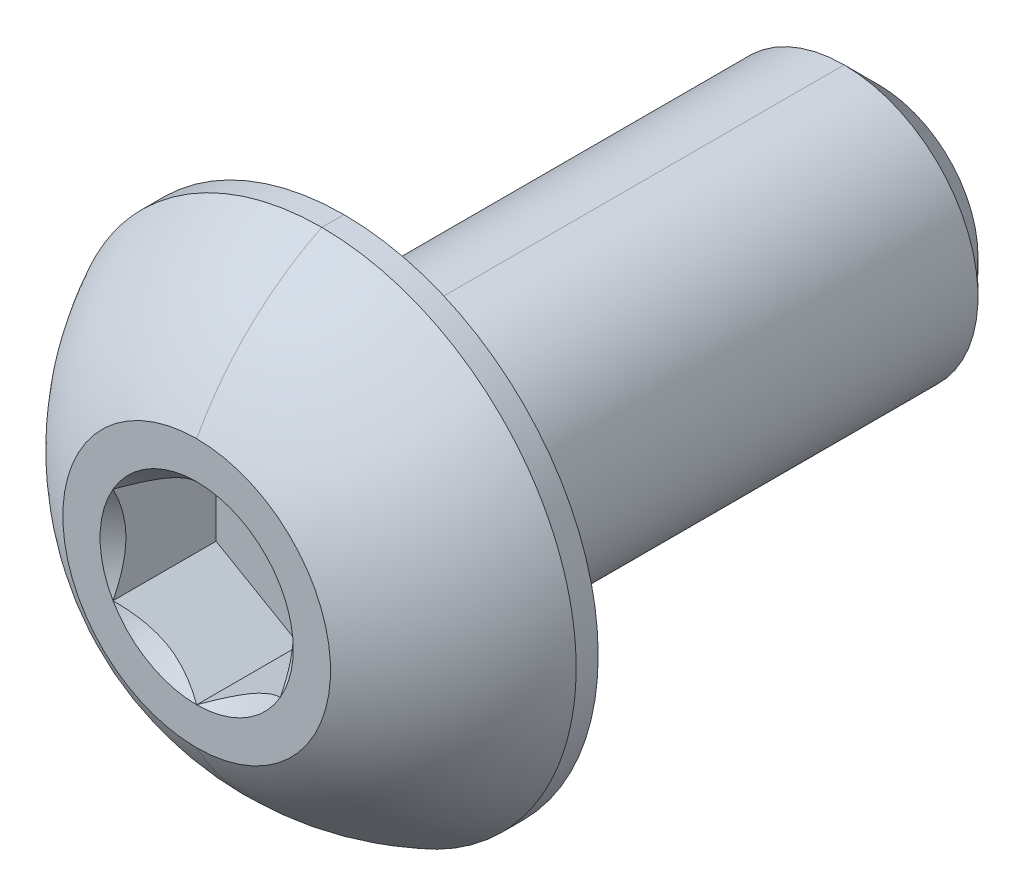
ISO-10303-21;
HEADER;
FILE_DESCRIPTION(('STEP AP214'),'2;1');
FILE_NAME('part.step','',(''),(''),'','','');
FILE_SCHEMA(('AUTOMOTIVE_DESIGN { 1 0 10303 214 1 1 1 1 }'));
ENDSEC;
DATA;
#1=APPLICATION_CONTEXT('core data for automotive mechanical design processes');
#2=APPLICATION_PROTOCOL_DEFINITION('international standard','automotive_design',2000,#1);
#3=PRODUCT_CONTEXT('',#1,'mechanical');
#4=PRODUCT('Part','Part','',(#3));
#5=PRODUCT_RELATED_PRODUCT_CATEGORY('part','',(#4));
#6=PRODUCT_DEFINITION_FORMATION('','',#4);
#7=PRODUCT_DEFINITION_CONTEXT('part definition',#1,'design');
#8=PRODUCT_DEFINITION('design','',#6,#7);
#9=PRODUCT_DEFINITION_SHAPE('','',#8);
#10=(LENGTH_UNIT() NAMED_UNIT(*) SI_UNIT(.MILLI.,.METRE.));
#11=(NAMED_UNIT(*) PLANE_ANGLE_UNIT() SI_UNIT($,.RADIAN.));
#12=(NAMED_UNIT(*) SI_UNIT($,.STERADIAN.) SOLID_ANGLE_UNIT());
#13=UNCERTAINTY_MEASURE_WITH_UNIT(LENGTH_MEASURE(1.E-05),#10,'distance_accuracy_value','');
#14=(GEOMETRIC_REPRESENTATION_CONTEXT(3) GLOBAL_UNCERTAINTY_ASSIGNED_CONTEXT((#13)) GLOBAL_UNIT_ASSIGNED_CONTEXT((#10,
#11,#12)) REPRESENTATION_CONTEXT('',''));
#15=CARTESIAN_POINT('',(0.,0.,0.));
#16=DIRECTION('',(0.,0.,1.));
#17=DIRECTION('',(1.,0.,0.));
#18=AXIS2_PLACEMENT_3D('',#15,#16,#17);
#19=CARTESIAN_POINT('',(0.,-1.44337567297407,4.66));
#20=DIRECTION('',(0.5,-0.866025403784439,0.));
#21=DIRECTION('',(0.,0.,-1.));
#22=AXIS2_PLACEMENT_3D('',#19,#20,#21);
#23=PLANE('',#22);
#24=DIRECTION('',(0.,0.,1.));
#25=VECTOR('',#24,1.);
#26=CARTESIAN_POINT('',(0.,-1.44337567297407,4.66));
#27=LINE('',#26,#25);
#28=CARTESIAN_POINT('',(0.,-1.44337567297407,4.66));
#29=VERTEX_POINT('',#28);
#30=CARTESIAN_POINT('',(0.,-1.44337567297406,6.2));
#31=VERTEX_POINT('',#30);
#32=EDGE_CURVE('E11',#29,#31,#27,.T.);
#33=ORIENTED_EDGE('',*,*,#32,.T.);
#34=CARTESIAN_POINT('',(0.,-1.44337567297407,6.2));
#35=CARTESIAN_POINT('',(0.333439312721844,-1.25086439601571,6.00748872304164));
#36=CARTESIAN_POINT('',(0.622697264378245,-1.08386123976164,6.00662715507142));
#37=CARTESIAN_POINT('',(0.913567808929031,-0.915927052565914,6.0057607839199));
#38=CARTESIAN_POINT('',(1.25,-0.721687836487034,6.2));
#39=B_SPLINE_CURVE_WITH_KNOTS('',2,(#34,#35,#36,#37,#38),.UNSPECIFIED.,.F.,.F.,(3,2,3),(0.,0.5,
1.),.UNSPECIFIED.);
#40=CARTESIAN_POINT('',(1.25,-0.721687836487033,6.2));
#41=VERTEX_POINT('',#40);
#42=EDGE_CURVE('E118',#31,#41,#39,.T.);
#43=ORIENTED_EDGE('',*,*,#42,.T.);
#44=DIRECTION('',(0.,0.,1.));
#45=VECTOR('',#44,1.);
#46=CARTESIAN_POINT('',(1.25,-0.721687836487034,4.66));
#47=LINE('',#46,#45);
#48=CARTESIAN_POINT('',(1.25,-0.721687836487034,4.66));
#49=VERTEX_POINT('',#48);
#50=EDGE_CURVE('E97',#49,#41,#47,.T.);
#51=ORIENTED_EDGE('',*,*,#50,.F.);
#52=DIRECTION('',(0.866025403784439,0.5,0.));
#53=VECTOR('',#52,1.);
#54=CARTESIAN_POINT('',(0.,-1.44337567297407,4.66));
#55=LINE('',#54,#53);
#56=EDGE_CURVE('E111',#29,#49,#55,.T.);
#57=ORIENTED_EDGE('',*,*,#56,.F.);
#58=EDGE_LOOP('',(#33,#43,#51,#57));
#59=FACE_BOUND('',#58,.T.);
#60=ADVANCED_FACE('F16',(#59),#23,.F.);
#61=CARTESIAN_POINT('',(-1.25,-0.721687836487034,4.66));
#62=DIRECTION('',(-0.5,-0.866025403784439,0.));
#63=DIRECTION('',(-0.866025403784439,0.5,0.));
#64=AXIS2_PLACEMENT_3D('',#61,#62,#63);
#65=PLANE('',#64);
#66=DIRECTION('',(0.,0.,1.));
#67=VECTOR('',#66,1.);
#68=CARTESIAN_POINT('',(-1.25,-0.721687836487034,4.66));
#69=LINE('',#68,#67);
#70=CARTESIAN_POINT('',(-1.25,-0.721687836487034,4.66));
#71=VERTEX_POINT('',#70);
#72=CARTESIAN_POINT('',(-1.25,-0.721687836487033,6.2));
#73=VERTEX_POINT('',#72);
#74=EDGE_CURVE('E28',#71,#73,#69,.T.);
#75=ORIENTED_EDGE('',*,*,#74,.T.);
#76=CARTESIAN_POINT('',(-1.25,-0.721687836487034,6.2));
#77=CARTESIAN_POINT('',(-0.916560687278626,-0.914199113445123,6.00748872304191));
#78=CARTESIAN_POINT('',(-0.627302735621756,-1.08120226969946,6.00662715507142));
#79=CARTESIAN_POINT('',(-0.336432191071441,-1.24913645689491,6.00576078391963));
#80=CARTESIAN_POINT('',(0.,-1.44337567297406,6.2));
#81=B_SPLINE_CURVE_WITH_KNOTS('',2,(#76,#77,#78,#79,#80),.UNSPECIFIED.,.F.,.F.,(3,2,3),(0.,0.5,
1.),.UNSPECIFIED.);
#82=EDGE_CURVE('E385',#73,#31,#81,.T.);
#83=ORIENTED_EDGE('',*,*,#82,.T.);
#84=ORIENTED_EDGE('',*,*,#32,.F.);
#85=DIRECTION('',(0.866025403784439,-0.5,0.));
#86=VECTOR('',#85,1.);
#87=CARTESIAN_POINT('',(-1.25,-0.721687836487034,4.66));
#88=LINE('',#87,#86);
#89=EDGE_CURVE('E128',#71,#29,#88,.T.);
#90=ORIENTED_EDGE('',*,*,#89,.F.);
#91=EDGE_LOOP('',(#75,#83,#84,#90));
#92=FACE_BOUND('',#91,.T.);
#93=ADVANCED_FACE('F349',(#92),#65,.F.);
#94=CARTESIAN_POINT('',(-1.25,0.72168783648703,4.66));
#95=DIRECTION('',(-1.,0.,0.));
#96=DIRECTION('',(0.,1.,0.));
#97=AXIS2_PLACEMENT_3D('',#94,#95,#96);
#98=PLANE('',#97);
#99=DIRECTION('',(0.,0.,1.));
#100=VECTOR('',#99,1.);
#101=CARTESIAN_POINT('',(-1.25,0.72168783648703,4.66));
#102=LINE('',#101,#100);
#103=CARTESIAN_POINT('',(-1.25,0.72168783648703,4.66));
#104=VERTEX_POINT('',#103);
#105=CARTESIAN_POINT('',(-1.25,0.721687836487029,6.2));
#106=VERTEX_POINT('',#105);
#107=EDGE_CURVE('E55',#104,#106,#102,.T.);
#108=ORIENTED_EDGE('',*,*,#107,.T.);
#109=CARTESIAN_POINT('',(-1.25,0.721687836487029,6.2));
#110=CARTESIAN_POINT('',(-1.25,0.538092414489135,6.10820228900105));
#111=CARTESIAN_POINT('',(-1.25,0.371670740916254,6.06070988390206));
#112=CARTESIAN_POINT('',(-1.25,0.182469151637206,6.00671668499652));
#113=CARTESIAN_POINT('',(-1.25,7.86844094999208E-05,6.00662432950243));
#114=CARTESIAN_POINT('',(-1.25,-0.181256710002667,6.00653250825651));
#115=CARTESIAN_POINT('',(-1.25,-0.371515987727134,6.06066578692546));
#116=CARTESIAN_POINT('',(-1.25,-0.537435467854396,6.10787381568368));
#117=CARTESIAN_POINT('',(-1.25,-0.721687836487034,6.2));
#118=B_SPLINE_CURVE_WITH_KNOTS('',2,(#109,#110,#111,#112,#113,#114,#115,#116,#117),
.UNSPECIFIED.,.F.,.F.,(3,2,2,2,3),(0.,0.25,0.5,0.75,1.),.UNSPECIFIED.);
#119=EDGE_CURVE('E360',#106,#73,#118,.T.);
#120=ORIENTED_EDGE('',*,*,#119,.T.);
#121=ORIENTED_EDGE('',*,*,#74,.F.);
#122=DIRECTION('',(0.,-1.,0.));
#123=VECTOR('',#122,1.);
#124=CARTESIAN_POINT('',(-1.25,0.72168783648703,4.66));
#125=LINE('',#124,#123);
#126=EDGE_CURVE('E124',#104,#71,#125,.T.);
#127=ORIENTED_EDGE('',*,*,#126,.F.);
#128=EDGE_LOOP('',(#108,#120,#121,#127));
#129=FACE_BOUND('',#128,.T.);
#130=ADVANCED_FACE('F346',(#129),#98,.F.);
#131=CARTESIAN_POINT('',(0.,1.44337567297406,4.66));
#132=DIRECTION('',(-0.5,0.866025403784439,0.));
#133=DIRECTION('',(0.,0.,1.));
#134=AXIS2_PLACEMENT_3D('',#131,#132,#133);
#135=PLANE('',#134);
#136=DIRECTION('',(0.,0.,1.));
#137=VECTOR('',#136,1.);
#138=CARTESIAN_POINT('',(0.,1.44337567297406,4.66));
#139=LINE('',#138,#137);
#140=CARTESIAN_POINT('',(0.,1.44337567297406,4.66));
#141=VERTEX_POINT('',#140);
#142=CARTESIAN_POINT('',(0.,1.44337567297406,6.2));
#143=VERTEX_POINT('',#142);
#144=EDGE_CURVE('E96',#141,#143,#139,.T.);
#145=ORIENTED_EDGE('',*,*,#144,.T.);
#146=CARTESIAN_POINT('',(0.,1.44337567297406,6.2));
#147=CARTESIAN_POINT('',(-0.33343931272091,1.25086439601624,6.00748872304218));
#148=CARTESIAN_POINT('',(-0.622697264378247,1.08386123976164,6.00662715507142));
#149=CARTESIAN_POINT('',(-0.913567808928087,0.915927052566455,6.00576078391935));
#150=CARTESIAN_POINT('',(-1.25,0.721687836487029,6.2));
#151=B_SPLINE_CURVE_WITH_KNOTS('',2,(#146,#147,#148,#149,#150),.UNSPECIFIED.,.F.,.F.,(3,2,3),
(0.,0.5,1.),.UNSPECIFIED.);
#152=EDGE_CURVE('E333',#143,#106,#151,.T.);
#153=ORIENTED_EDGE('',*,*,#152,.T.);
#154=ORIENTED_EDGE('',*,*,#107,.F.);
#155=DIRECTION('',(-0.866025403784439,-0.5,0.));
#156=VECTOR('',#155,1.);
#157=CARTESIAN_POINT('',(0.,1.44337567297406,4.66));
#158=LINE('',#157,#156);
#159=EDGE_CURVE('E106',#141,#104,#158,.T.);
#160=ORIENTED_EDGE('',*,*,#159,.F.);
#161=EDGE_LOOP('',(#145,#153,#154,#160));
#162=FACE_BOUND('',#161,.T.);
#163=ADVANCED_FACE('F337',(#162),#135,.F.);
#164=CARTESIAN_POINT('',(1.25,0.721687836487031,4.66));
#165=DIRECTION('',(0.5,0.866025403784439,0.));
#166=DIRECTION('',(0.,0.,-1.));
#167=AXIS2_PLACEMENT_3D('',#164,#165,#166);
#168=PLANE('',#167);
#169=DIRECTION('',(0.,0.,1.));
#170=VECTOR('',#169,1.);
#171=CARTESIAN_POINT('',(1.25,0.721687836487031,4.66));
#172=LINE('',#171,#170);
#173=CARTESIAN_POINT('',(1.25,0.721687836487031,4.66));
#174=VERTEX_POINT('',#173);
#175=CARTESIAN_POINT('',(1.25,0.721687836487031,6.2));
#176=VERTEX_POINT('',#175);
#177=EDGE_CURVE('E80',#174,#176,#172,.T.);
#178=ORIENTED_EDGE('',*,*,#177,.T.);
#179=CARTESIAN_POINT('',(1.25,0.721687836487031,6.2));
#180=CARTESIAN_POINT('',(0.916560687277691,0.91419911344566,6.00748872304137));
#181=CARTESIAN_POINT('',(0.627302735621755,1.08120226969945,6.00662715507142));
#182=CARTESIAN_POINT('',(0.336432191070495,1.24913645689546,6.00576078392016));
#183=CARTESIAN_POINT('',(0.,1.44337567297406,6.2));
#184=B_SPLINE_CURVE_WITH_KNOTS('',2,(#179,#180,#181,#182,#183),.UNSPECIFIED.,.F.,.F.,(3,2,3),
(0.,0.5,1.),.UNSPECIFIED.);
#185=EDGE_CURVE('E269',#176,#143,#184,.T.);
#186=ORIENTED_EDGE('',*,*,#185,.T.);
#187=ORIENTED_EDGE('',*,*,#144,.F.);
#188=DIRECTION('',(-0.866025403784439,0.5,0.));
#189=VECTOR('',#188,1.);
#190=CARTESIAN_POINT('',(1.25,0.721687836487031,4.66));
#191=LINE('',#190,#189);
#192=EDGE_CURVE('E100',#174,#141,#191,.T.);
#193=ORIENTED_EDGE('',*,*,#192,.F.);
#194=EDGE_LOOP('',(#178,#186,#187,#193));
#195=FACE_BOUND('',#194,.T.);
#196=ADVANCED_FACE('F101',(#195),#168,.F.);
#197=CARTESIAN_POINT('',(1.25,-0.721687836487034,4.66));
#198=DIRECTION('',(1.,0.,0.));
#199=DIRECTION('',(0.,1.,0.));
#200=AXIS2_PLACEMENT_3D('',#197,#198,#199);
#201=PLANE('',#200);
#202=ORIENTED_EDGE('',*,*,#50,.T.);
#203=CARTESIAN_POINT('',(1.25,-0.721687836487033,6.2));
#204=CARTESIAN_POINT('',(1.25,-0.538882168791192,6.10859716615208));
#205=CARTESIAN_POINT('',(1.25,-0.371553327845962,6.0606764254612));
#206=CARTESIAN_POINT('',(1.25,-0.182815114466231,6.00662432702594));
#207=CARTESIAN_POINT('',(1.25,0.,6.00662432702594));
#208=B_SPLINE_CURVE_WITH_KNOTS('',2,(#203,#204,#205,#206,#207),.UNSPECIFIED.,.F.,.F.,(3,2,3),
(0.,0.5,1.),.UNSPECIFIED.);
#209=CARTESIAN_POINT('',(1.25,0.,6.00662432702594));
#210=VERTEX_POINT('',#209);
#211=EDGE_CURVE('E367',#41,#210,#208,.T.);
#212=ORIENTED_EDGE('',*,*,#211,.T.);
#213=CARTESIAN_POINT('',(1.25,0.,6.00662432702594));
#214=CARTESIAN_POINT('',(1.25,0.18089664890035,6.00662432702594));
#215=CARTESIAN_POINT('',(1.25,0.371633306232304,6.0606992153283));
#216=CARTESIAN_POINT('',(1.25,0.536655871568196,6.10748401754058));
#217=CARTESIAN_POINT('',(1.25,0.72168783648703,6.2));
#218=B_SPLINE_CURVE_WITH_KNOTS('',2,(#213,#214,#215,#216,#217),.UNSPECIFIED.,.F.,.F.,(3,2,3),
(0.,0.5,1.),.UNSPECIFIED.);
#219=EDGE_CURVE('E90',#210,#176,#218,.T.);
#220=ORIENTED_EDGE('',*,*,#219,.T.);
#221=ORIENTED_EDGE('',*,*,#177,.F.);
#222=DIRECTION('',(0.,1.,0.));
#223=VECTOR('',#222,1.);
#224=CARTESIAN_POINT('',(1.25,-0.721687836487034,4.66));
#225=LINE('',#224,#223);
#226=EDGE_CURVE('E85',#49,#174,#225,.T.);
#227=ORIENTED_EDGE('',*,*,#226,.F.);
#228=EDGE_LOOP('',(#202,#212,#220,#221,#227));
#229=FACE_BOUND('',#228,.T.);
#230=ADVANCED_FACE('F83',(#229),#201,.F.);
#231=CARTESIAN_POINT('',(1.25,-0.721687836487033,4.66));
#232=DIRECTION('',(0.,0.,1.));
#233=DIRECTION('',(1.,0.,0.));
#234=AXIS2_PLACEMENT_3D('',#231,#232,#233);
#235=PLANE('',#234);
#236=ORIENTED_EDGE('',*,*,#56,.T.);
#237=ORIENTED_EDGE('',*,*,#226,.T.);
#238=ORIENTED_EDGE('',*,*,#192,.T.);
#239=ORIENTED_EDGE('',*,*,#159,.T.);
#240=ORIENTED_EDGE('',*,*,#126,.T.);
#241=ORIENTED_EDGE('',*,*,#89,.T.);
#242=EDGE_LOOP('',(#236,#237,#238,#239,#240,#241));
#243=FACE_BOUND('',#242,.T.);
#244=ADVANCED_FACE('F108',(#243),#235,.T.);
#245=CARTESIAN_POINT('',(0.,0.,6.2));
#246=DIRECTION('',(0.,0.,1.));
#247=DIRECTION('',(1.,0.,0.));
#248=AXIS2_PLACEMENT_3D('',#245,#246,#247);
#249=CONICAL_SURFACE('',#248,1.44337567297406,0.78539816339745);
#250=CARTESIAN_POINT('',(0.,0.,6.2));
#251=DIRECTION('',(0.,0.,1.));
#252=DIRECTION('',(1.,0.,0.));
#253=AXIS2_PLACEMENT_3D('',#250,#251,#252);
#254=CIRCLE('',#253,1.44337567297406);
#255=EDGE_CURVE('E401',#31,#41,#254,.T.);
#256=ORIENTED_EDGE('',*,*,#255,.T.);
#257=ORIENTED_EDGE('',*,*,#42,.F.);
#258=EDGE_LOOP('',(#256,#257));
#259=FACE_BOUND('',#258,.T.);
#260=ADVANCED_FACE('F153',(#259),#249,.F.);
#261=CARTESIAN_POINT('',(0.,0.,6.2));
#262=DIRECTION('',(0.,0.,1.));
#263=DIRECTION('',(1.,0.,0.));
#264=AXIS2_PLACEMENT_3D('',#261,#262,#263);
#265=CONICAL_SURFACE('',#264,1.44337567297406,0.78539816339745);
#266=CARTESIAN_POINT('',(0.,0.,6.2));
#267=DIRECTION('',(0.,0.,1.));
#268=DIRECTION('',(1.,0.,0.));
#269=AXIS2_PLACEMENT_3D('',#266,#267,#268);
#270=CIRCLE('',#269,1.44337567297406);
#271=EDGE_CURVE('E368',#73,#31,#270,.T.);
#272=ORIENTED_EDGE('',*,*,#271,.T.);
#273=ORIENTED_EDGE('',*,*,#82,.F.);
#274=EDGE_LOOP('',(#272,#273));
#275=FACE_BOUND('',#274,.T.);
#276=ADVANCED_FACE('F163',(#275),#265,.F.);
#277=CARTESIAN_POINT('',(0.,0.,6.2));
#278=DIRECTION('',(0.,0.,1.));
#279=DIRECTION('',(1.,0.,0.));
#280=AXIS2_PLACEMENT_3D('',#277,#278,#279);
#281=CONICAL_SURFACE('',#280,1.44337567297406,0.78539816339745);
#282=CARTESIAN_POINT('',(0.,0.,6.2));
#283=DIRECTION('',(0.,0.,1.));
#284=DIRECTION('',(1.,0.,0.));
#285=AXIS2_PLACEMENT_3D('',#282,#283,#284);
#286=CIRCLE('',#285,1.44337567297406);
#287=EDGE_CURVE('E364',#106,#73,#286,.T.);
#288=ORIENTED_EDGE('',*,*,#287,.T.);
#289=ORIENTED_EDGE('',*,*,#119,.F.);
#290=EDGE_LOOP('',(#288,#289));
#291=FACE_BOUND('',#290,.T.);
#292=ADVANCED_FACE('F240',(#291),#281,.F.);
#293=CARTESIAN_POINT('',(0.,0.,6.2));
#294=DIRECTION('',(0.,0.,1.));
#295=DIRECTION('',(1.,0.,0.));
#296=AXIS2_PLACEMENT_3D('',#293,#294,#295);
#297=CONICAL_SURFACE('',#296,1.44337567297406,0.78539816339745);
#298=CARTESIAN_POINT('',(0.,0.,6.2));
#299=DIRECTION('',(0.,0.,1.));
#300=DIRECTION('',(1.,0.,0.));
#301=AXIS2_PLACEMENT_3D('',#298,#299,#300);
#302=CIRCLE('',#301,1.44337567297406);
#303=EDGE_CURVE('E264',#143,#106,#302,.T.);
#304=ORIENTED_EDGE('',*,*,#303,.T.);
#305=ORIENTED_EDGE('',*,*,#152,.F.);
#306=EDGE_LOOP('',(#304,#305));
#307=FACE_BOUND('',#306,.T.);
#308=ADVANCED_FACE('F236',(#307),#297,.F.);
#309=CARTESIAN_POINT('',(0.,0.,6.2));
#310=DIRECTION('',(0.,0.,1.));
#311=DIRECTION('',(1.,0.,0.));
#312=AXIS2_PLACEMENT_3D('',#309,#310,#311);
#313=CONICAL_SURFACE('',#312,1.44337567297406,0.78539816339745);
#314=CARTESIAN_POINT('',(0.,0.,6.2));
#315=DIRECTION('',(0.,0.,1.));
#316=DIRECTION('',(1.,0.,0.));
#317=AXIS2_PLACEMENT_3D('',#314,#315,#316);
#318=CIRCLE('',#317,1.44337567297406);
#319=EDGE_CURVE('E259',#176,#143,#318,.T.);
#320=ORIENTED_EDGE('',*,*,#319,.T.);
#321=ORIENTED_EDGE('',*,*,#185,.F.);
#322=EDGE_LOOP('',(#320,#321));
#323=FACE_BOUND('',#322,.T.);
#324=ADVANCED_FACE('F228',(#323),#313,.F.);
#325=CARTESIAN_POINT('',(0.,0.,6.2));
#326=DIRECTION('',(0.,0.,1.));
#327=DIRECTION('',(1.,0.,0.));
#328=AXIS2_PLACEMENT_3D('',#325,#326,#327);
#329=CONICAL_SURFACE('',#328,1.44337567297406,0.78539816339745);
#330=DIRECTION('',(0.707106781186549,0.,0.707106781186546));
#331=VECTOR('',#330,1.);
#332=CARTESIAN_POINT('',(1.44337567297406,0.,6.2));
#333=LINE('',#332,#331);
#334=CARTESIAN_POINT('',(1.44337567297406,0.,6.2));
#335=VERTEX_POINT('',#334);
#336=EDGE_CURVE('E195',#210,#335,#333,.T.);
#337=ORIENTED_EDGE('',*,*,#336,.F.);
#338=ORIENTED_EDGE('',*,*,#211,.F.);
#339=CARTESIAN_POINT('',(0.,0.,6.2));
#340=DIRECTION('',(0.,0.,1.));
#341=DIRECTION('',(1.,0.,0.));
#342=AXIS2_PLACEMENT_3D('',#339,#340,#341);
#343=CIRCLE('',#342,1.44337567297406);
#344=EDGE_CURVE('E263',#41,#335,#343,.T.);
#345=ORIENTED_EDGE('',*,*,#344,.T.);
#346=EDGE_LOOP('',(#337,#338,#345));
#347=FACE_BOUND('',#346,.T.);
#348=ADVANCED_FACE('F217',(#347),#329,.F.);
#349=CARTESIAN_POINT('',(0.,0.,6.2));
#350=DIRECTION('',(0.,0.,1.));
#351=DIRECTION('',(0.,-1.,0.));
#352=AXIS2_PLACEMENT_3D('',#349,#350,#351);
#353=CYLINDRICAL_SURFACE('',#352,3.8);
#354=DIRECTION('',(0.,0.,1.));
#355=VECTOR('',#354,1.);
#356=CARTESIAN_POINT('',(0.,3.8,6.2));
#357=LINE('',#356,#355);
#358=CARTESIAN_POINT('',(0.,3.8,4.));
#359=VERTEX_POINT('',#358);
#360=CARTESIAN_POINT('',(0.,3.8,4.33));
#361=VERTEX_POINT('',#360);
#362=EDGE_CURVE('E551',#359,#361,#357,.T.);
#363=ORIENTED_EDGE('',*,*,#362,.F.);
#364=CARTESIAN_POINT('',(0.,0.,4.));
#365=DIRECTION('',(0.,0.,1.));
#366=DIRECTION('',(0.,-1.,0.));
#367=AXIS2_PLACEMENT_3D('',#364,#365,#366);
#368=CIRCLE('',#367,3.8);
#369=CARTESIAN_POINT('',(0.,-3.8,4.));
#370=VERTEX_POINT('',#369);
#371=EDGE_CURVE('E539',#359,#370,#368,.T.);
#372=ORIENTED_EDGE('',*,*,#371,.T.);
#373=DIRECTION('',(0.,0.,1.));
#374=VECTOR('',#373,1.);
#375=CARTESIAN_POINT('',(0.,-3.8,6.2));
#376=LINE('',#375,#374);
#377=CARTESIAN_POINT('',(0.,-3.8,4.33));
#378=VERTEX_POINT('',#377);
#379=EDGE_CURVE('E503',#370,#378,#376,.T.);
#380=ORIENTED_EDGE('',*,*,#379,.T.);
#381=CARTESIAN_POINT('',(0.,0.,4.33));
#382=DIRECTION('',(0.,0.,1.));
#383=DIRECTION('',(0.,-1.,0.));
#384=AXIS2_PLACEMENT_3D('',#381,#382,#383);
#385=CIRCLE('',#384,3.8);
#386=EDGE_CURVE('E494',#361,#378,#385,.T.);
#387=ORIENTED_EDGE('',*,*,#386,.F.);
#388=EDGE_LOOP('',(#363,#372,#380,#387));
#389=FACE_BOUND('',#388,.T.);
#390=ADVANCED_FACE('F227',(#389),#353,.T.);
#391=CARTESIAN_POINT('',(0.,-2.,6.2));
#392=DIRECTION('',(0.,0.,-1.));
#393=DIRECTION('',(-1.,0.,0.));
#394=AXIS2_PLACEMENT_3D('',#391,#392,#393);
#395=PLANE('',#394);
#396=ORIENTED_EDGE('',*,*,#303,.F.);
#397=ORIENTED_EDGE('',*,*,#319,.F.);
#398=CARTESIAN_POINT('',(0.,0.,6.2));
#399=DIRECTION('',(0.,0.,1.));
#400=DIRECTION('',(1.,0.,0.));
#401=AXIS2_PLACEMENT_3D('',#398,#399,#400);
#402=CIRCLE('',#401,1.44337567297406);
#403=EDGE_CURVE('E197',#335,#176,#402,.T.);
#404=ORIENTED_EDGE('',*,*,#403,.F.);
#405=ORIENTED_EDGE('',*,*,#344,.F.);
#406=ORIENTED_EDGE('',*,*,#255,.F.);
#407=ORIENTED_EDGE('',*,*,#271,.F.);
#408=ORIENTED_EDGE('',*,*,#287,.F.);
#409=EDGE_LOOP('',(#396,#397,#404,#405,#406,#407,#408));
#410=FACE_BOUND('',#409,.T.);
#411=CARTESIAN_POINT('',(0.,0.,6.2));
#412=DIRECTION('',(0.,0.,1.));
#413=DIRECTION('',(0.,-1.,0.));
#414=AXIS2_PLACEMENT_3D('',#411,#412,#413);
#415=CIRCLE('',#414,2.);
#416=CARTESIAN_POINT('',(0.,-2.,6.2));
#417=VERTEX_POINT('',#416);
#418=CARTESIAN_POINT('',(0.,2.,6.2));
#419=VERTEX_POINT('',#418);
#420=EDGE_CURVE('E495',#417,#419,#415,.T.);
#421=ORIENTED_EDGE('',*,*,#420,.T.);
#422=CARTESIAN_POINT('',(0.,0.,6.2));
#423=DIRECTION('',(0.,0.,1.));
#424=DIRECTION('',(0.,-1.,0.));
#425=AXIS2_PLACEMENT_3D('',#422,#423,#424);
#426=CIRCLE('',#425,2.);
#427=EDGE_CURVE('E329',#419,#417,#426,.T.);
#428=ORIENTED_EDGE('',*,*,#427,.T.);
#429=EDGE_LOOP('',(#421,#428));
#430=FACE_BOUND('',#429,.T.);
#431=ADVANCED_FACE('F294',(#410,#430),#395,.F.);
#432=CARTESIAN_POINT('',(0.,0.,2.47355614973262));
#433=DIRECTION('',(1.,0.,0.));
#434=DIRECTION('',(0.,-1.,0.));
#435=AXIS2_PLACEMENT_3D('',#432,#433,#434);
#436=SPHERICAL_SURFACE('',#435,4.22922968981297);
#437=CARTESIAN_POINT('',(0.,0.,2.47355614973262));
#438=DIRECTION('',(1.,0.,0.));
#439=DIRECTION('',(0.,1.,0.));
#440=AXIS2_PLACEMENT_3D('',#437,#438,#439);
#441=CIRCLE('',#440,4.22922968981297);
#442=EDGE_CURVE('E488',#361,#419,#441,.T.);
#443=ORIENTED_EDGE('',*,*,#442,.F.);
#444=ORIENTED_EDGE('',*,*,#386,.T.);
#445=CARTESIAN_POINT('',(0.,0.,2.47355614973262));
#446=DIRECTION('',(-1.,0.,0.));
#447=DIRECTION('',(0.,-1.,0.));
#448=AXIS2_PLACEMENT_3D('',#445,#446,#447);
#449=CIRCLE('',#448,4.22922968981297);
#450=EDGE_CURVE('E491',#378,#417,#449,.T.);
#451=ORIENTED_EDGE('',*,*,#450,.T.);
#452=ORIENTED_EDGE('',*,*,#427,.F.);
#453=EDGE_LOOP('',(#443,#444,#451,#452));
#454=FACE_BOUND('',#453,.T.);
#455=ADVANCED_FACE('F300',(#454),#436,.T.);
#456=CARTESIAN_POINT('',(0.,-3.8,4.));
#457=DIRECTION('',(0.,0.,1.));
#458=DIRECTION('',(0.,-1.,0.));
#459=AXIS2_PLACEMENT_3D('',#456,#457,#458);
#460=PLANE('',#459);
#461=CARTESIAN_POINT('',(0.,0.,4.));
#462=DIRECTION('',(0.,0.,1.));
#463=DIRECTION('',(0.,-1.,0.));
#464=AXIS2_PLACEMENT_3D('',#461,#462,#463);
#465=CIRCLE('',#464,2.);
#466=CARTESIAN_POINT('',(0.,-2.,4.));
#467=VERTEX_POINT('',#466);
#468=CARTESIAN_POINT('',(0.,2.,4.));
#469=VERTEX_POINT('',#468);
#470=EDGE_CURVE('E518',#467,#469,#465,.T.);
#471=ORIENTED_EDGE('',*,*,#470,.T.);
#472=CARTESIAN_POINT('',(0.,0.,4.));
#473=DIRECTION('',(0.,0.,1.));
#474=DIRECTION('',(0.,-1.,0.));
#475=AXIS2_PLACEMENT_3D('',#472,#473,#474);
#476=CIRCLE('',#475,2.);
#477=EDGE_CURVE('E538',#469,#467,#476,.T.);
#478=ORIENTED_EDGE('',*,*,#477,.T.);
#479=EDGE_LOOP('',(#471,#478));
#480=FACE_BOUND('',#479,.T.);
#481=CARTESIAN_POINT('',(0.,0.,4.));
#482=DIRECTION('',(0.,0.,1.));
#483=DIRECTION('',(0.,-1.,0.));
#484=AXIS2_PLACEMENT_3D('',#481,#482,#483);
#485=CIRCLE('',#484,3.8);
#486=EDGE_CURVE('E210',#370,#359,#485,.T.);
#487=ORIENTED_EDGE('',*,*,#486,.F.);
#488=ORIENTED_EDGE('',*,*,#371,.F.);
#489=EDGE_LOOP('',(#487,#488));
#490=FACE_BOUND('',#489,.T.);
#491=ADVANCED_FACE('F296',(#480,#490),#460,.F.);
#492=CARTESIAN_POINT('',(0.,0.,6.2));
#493=DIRECTION('',(0.,0.,1.));
#494=DIRECTION('',(0.,-1.,0.));
#495=AXIS2_PLACEMENT_3D('',#492,#493,#494);
#496=CYLINDRICAL_SURFACE('',#495,2.);
#497=DIRECTION('',(0.,0.,1.));
#498=VECTOR('',#497,1.);
#499=CARTESIAN_POINT('',(0.,2.,6.2));
#500=LINE('',#499,#498);
#501=CARTESIAN_POINT('',(0.,2.,-3.475));
#502=VERTEX_POINT('',#501);
#503=EDGE_CURVE('E514',#502,#469,#500,.T.);
#504=ORIENTED_EDGE('',*,*,#503,.F.);
#505=CARTESIAN_POINT('',(0.,0.,-3.475));
#506=DIRECTION('',(0.,0.,1.));
#507=DIRECTION('',(0.,-1.,0.));
#508=AXIS2_PLACEMENT_3D('',#505,#506,#507);
#509=CIRCLE('',#508,2.);
#510=CARTESIAN_POINT('',(0.,-2.,-3.475));
#511=VERTEX_POINT('',#510);
#512=EDGE_CURVE('E535',#502,#511,#509,.T.);
#513=ORIENTED_EDGE('',*,*,#512,.T.);
#514=DIRECTION('',(0.,0.,1.));
#515=VECTOR('',#514,1.);
#516=CARTESIAN_POINT('',(0.,-2.,6.2));
#517=LINE('',#516,#515);
#518=EDGE_CURVE('E522',#511,#467,#517,.T.);
#519=ORIENTED_EDGE('',*,*,#518,.T.);
#520=ORIENTED_EDGE('',*,*,#477,.F.);
#521=EDGE_LOOP('',(#504,#513,#519,#520));
#522=FACE_BOUND('',#521,.T.);
#523=ADVANCED_FACE('F299',(#522),#496,.T.);
#524=CARTESIAN_POINT('',(0.,0.,-4.));
#525=DIRECTION('',(0.,0.,1.));
#526=DIRECTION('',(0.,-1.,0.));
#527=AXIS2_PLACEMENT_3D('',#524,#525,#526);
#528=CONICAL_SURFACE('',#527,1.475,0.785398163397447);
#529=DIRECTION('',(0.,0.707106781186546,0.707106781186549));
#530=VECTOR('',#529,1.);
#531=CARTESIAN_POINT('',(0.,1.475,-4.));
#532=LINE('',#531,#530);
#533=CARTESIAN_POINT('',(0.,1.475,-4.));
#534=VERTEX_POINT('',#533);
#535=EDGE_CURVE('E523',#534,#502,#532,.T.);
#536=ORIENTED_EDGE('',*,*,#535,.F.);
#537=CARTESIAN_POINT('',(0.,0.,-4.));
#538=DIRECTION('',(0.,0.,1.));
#539=DIRECTION('',(0.,-1.,0.));
#540=AXIS2_PLACEMENT_3D('',#537,#538,#539);
#541=CIRCLE('',#540,1.475);
#542=CARTESIAN_POINT('',(0.,-1.475,-4.));
#543=VERTEX_POINT('',#542);
#544=EDGE_CURVE('E532',#534,#543,#541,.T.);
#545=ORIENTED_EDGE('',*,*,#544,.T.);
#546=DIRECTION('',(0.,-0.707106781186547,0.707106781186549));
#547=VECTOR('',#546,1.);
#548=CARTESIAN_POINT('',(0.,-1.475,-4.));
#549=LINE('',#548,#547);
#550=EDGE_CURVE('E527',#543,#511,#549,.T.);
#551=ORIENTED_EDGE('',*,*,#550,.T.);
#552=ORIENTED_EDGE('',*,*,#512,.F.);
#553=EDGE_LOOP('',(#536,#545,#551,#552));
#554=FACE_BOUND('',#553,.T.);
#555=ADVANCED_FACE('F581',(#554),#528,.T.);
#556=CARTESIAN_POINT('',(0.,0.,-4.));
#557=DIRECTION('',(0.,0.,1.));
#558=DIRECTION('',(0.,-1.,0.));
#559=AXIS2_PLACEMENT_3D('',#556,#557,#558);
#560=PLANE('',#559);
#561=CARTESIAN_POINT('',(0.,0.,-4.));
#562=DIRECTION('',(0.,0.,1.));
#563=DIRECTION('',(0.,-1.,0.));
#564=AXIS2_PLACEMENT_3D('',#561,#562,#563);
#565=CIRCLE('',#564,1.475);
#566=EDGE_CURVE('E528',#543,#534,#565,.T.);
#567=ORIENTED_EDGE('',*,*,#566,.F.);
#568=ORIENTED_EDGE('',*,*,#544,.F.);
#569=EDGE_LOOP('',(#567,#568));
#570=FACE_BOUND('',#569,.T.);
#571=ADVANCED_FACE('F583',(#570),#560,.F.);
#572=CARTESIAN_POINT('',(0.,0.,-4.));
#573=DIRECTION('',(0.,0.,1.));
#574=DIRECTION('',(0.,-1.,0.));
#575=AXIS2_PLACEMENT_3D('',#572,#573,#574);
#576=CONICAL_SURFACE('',#575,1.475,0.785398163397447);
#577=ORIENTED_EDGE('',*,*,#566,.T.);
#578=ORIENTED_EDGE('',*,*,#535,.T.);
#579=CARTESIAN_POINT('',(0.,0.,-3.475));
#580=DIRECTION('',(0.,0.,1.));
#581=DIRECTION('',(0.,-1.,0.));
#582=AXIS2_PLACEMENT_3D('',#579,#580,#581);
#583=CIRCLE('',#582,2.);
#584=EDGE_CURVE('E513',#511,#502,#583,.T.);
#585=ORIENTED_EDGE('',*,*,#584,.F.);
#586=ORIENTED_EDGE('',*,*,#550,.F.);
#587=EDGE_LOOP('',(#577,#578,#585,#586));
#588=FACE_BOUND('',#587,.T.);
#589=ADVANCED_FACE('F234',(#588),#576,.T.);
#590=CARTESIAN_POINT('',(0.,0.,6.2));
#591=DIRECTION('',(0.,0.,1.));
#592=DIRECTION('',(0.,-1.,0.));
#593=AXIS2_PLACEMENT_3D('',#590,#591,#592);
#594=CYLINDRICAL_SURFACE('',#593,2.);
#595=ORIENTED_EDGE('',*,*,#584,.T.);
#596=ORIENTED_EDGE('',*,*,#503,.T.);
#597=ORIENTED_EDGE('',*,*,#470,.F.);
#598=ORIENTED_EDGE('',*,*,#518,.F.);
#599=EDGE_LOOP('',(#595,#596,#597,#598));
#600=FACE_BOUND('',#599,.T.);
#601=ADVANCED_FACE('F231',(#600),#594,.T.);
#602=CARTESIAN_POINT('',(0.,0.,2.47355614973262));
#603=DIRECTION('',(1.,0.,0.));
#604=DIRECTION('',(0.,-1.,0.));
#605=AXIS2_PLACEMENT_3D('',#602,#603,#604);
#606=SPHERICAL_SURFACE('',#605,4.22922968981297);
#607=CARTESIAN_POINT('',(0.,0.,4.33));
#608=DIRECTION('',(0.,0.,1.));
#609=DIRECTION('',(0.,-1.,0.));
#610=AXIS2_PLACEMENT_3D('',#607,#608,#609);
#611=CIRCLE('',#610,3.8);
#612=EDGE_CURVE('E500',#378,#361,#611,.T.);
#613=ORIENTED_EDGE('',*,*,#612,.T.);
#614=ORIENTED_EDGE('',*,*,#442,.T.);
#615=ORIENTED_EDGE('',*,*,#420,.F.);
#616=ORIENTED_EDGE('',*,*,#450,.F.);
#617=EDGE_LOOP('',(#613,#614,#615,#616));
#618=FACE_BOUND('',#617,.T.);
#619=ADVANCED_FACE('F230',(#618),#606,.T.);
#620=CARTESIAN_POINT('',(0.,0.,6.2));
#621=DIRECTION('',(0.,0.,1.));
#622=DIRECTION('',(0.,-1.,0.));
#623=AXIS2_PLACEMENT_3D('',#620,#621,#622);
#624=CYLINDRICAL_SURFACE('',#623,3.8);
#625=ORIENTED_EDGE('',*,*,#486,.T.);
#626=ORIENTED_EDGE('',*,*,#362,.T.);
#627=ORIENTED_EDGE('',*,*,#612,.F.);
#628=ORIENTED_EDGE('',*,*,#379,.F.);
#629=EDGE_LOOP('',(#625,#626,#627,#628));
#630=FACE_BOUND('',#629,.T.);
#631=ADVANCED_FACE('F550',(#630),#624,.T.);
#632=CARTESIAN_POINT('',(0.,0.,6.2));
#633=DIRECTION('',(0.,0.,1.));
#634=DIRECTION('',(1.,0.,0.));
#635=AXIS2_PLACEMENT_3D('',#632,#633,#634);
#636=CONICAL_SURFACE('',#635,1.44337567297406,0.78539816339745);
#637=ORIENTED_EDGE('',*,*,#219,.F.);
#638=ORIENTED_EDGE('',*,*,#336,.T.);
#639=ORIENTED_EDGE('',*,*,#403,.T.);
#640=EDGE_LOOP('',(#637,#638,#639));
#641=FACE_BOUND('',#640,.T.);
#642=ADVANCED_FACE('F192',(#641),#636,.F.);
#643=CLOSED_SHELL('',(#60,#93,#130,#163,#196,#230,#244,#260,#276,#292,#308,#324,#348,#390,#431,
#455,#491,#523,#555,#571,#589,#601,#619,#631,#642));
#644=MANIFOLD_SOLID_BREP('B1',#643);
#645=ADVANCED_BREP_SHAPE_REPRESENTATION('',(#18,#644),#14);
#646=SHAPE_DEFINITION_REPRESENTATION(#9,#645);
ENDSEC;
END-ISO-10303-21;
